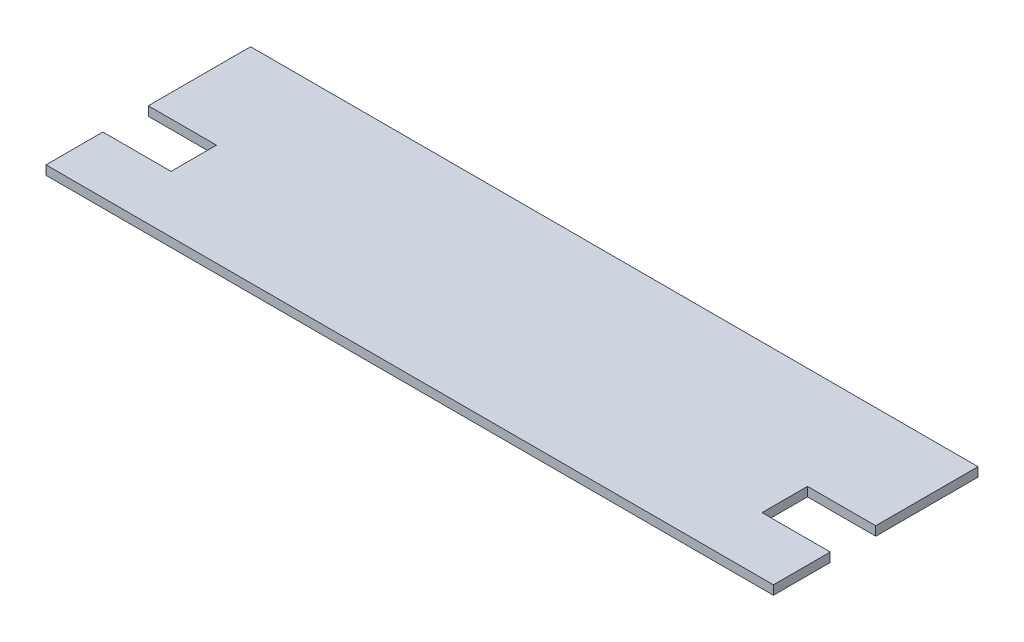
ISO-10303-21;
HEADER;
FILE_DESCRIPTION(('STEP AP214'),'2;1');
FILE_NAME('part.step','',(''),(''),'','','');
FILE_SCHEMA(('AUTOMOTIVE_DESIGN { 1 0 10303 214 1 1 1 1 }'));
ENDSEC;
DATA;
#1=APPLICATION_CONTEXT('core data for automotive mechanical design processes');
#2=APPLICATION_PROTOCOL_DEFINITION('international standard','automotive_design',2000,#1);
#3=PRODUCT_CONTEXT('',#1,'mechanical');
#4=PRODUCT('Part','Part','',(#3));
#5=PRODUCT_RELATED_PRODUCT_CATEGORY('part','',(#4));
#6=PRODUCT_DEFINITION_FORMATION('','',#4);
#7=PRODUCT_DEFINITION_CONTEXT('part definition',#1,'design');
#8=PRODUCT_DEFINITION('design','',#6,#7);
#9=PRODUCT_DEFINITION_SHAPE('','',#8);
#10=(LENGTH_UNIT() NAMED_UNIT(*) SI_UNIT(.MILLI.,.METRE.));
#11=(NAMED_UNIT(*) PLANE_ANGLE_UNIT() SI_UNIT($,.RADIAN.));
#12=(NAMED_UNIT(*) SI_UNIT($,.STERADIAN.) SOLID_ANGLE_UNIT());
#13=UNCERTAINTY_MEASURE_WITH_UNIT(LENGTH_MEASURE(1.E-05),#10,'distance_accuracy_value','');
#14=(GEOMETRIC_REPRESENTATION_CONTEXT(3) GLOBAL_UNCERTAINTY_ASSIGNED_CONTEXT((#13)) GLOBAL_UNIT_ASSIGNED_CONTEXT((#10,
#11,#12)) REPRESENTATION_CONTEXT('',''));
#15=CARTESIAN_POINT('',(0.,0.,0.));
#16=DIRECTION('',(0.,0.,1.));
#17=DIRECTION('',(1.,0.,0.));
#18=AXIS2_PLACEMENT_3D('',#15,#16,#17);
#19=CARTESIAN_POINT('',(0.,4.,0.));
#20=DIRECTION('',(1.,0.,0.));
#21=DIRECTION('',(0.,0.,-1.));
#22=AXIS2_PLACEMENT_3D('',#19,#20,#21);
#23=PLANE('',#22);
#24=DIRECTION('',(0.,0.,1.));
#25=VECTOR('',#24,1.);
#26=CARTESIAN_POINT('',(0.,4.,0.));
#27=LINE('',#26,#25);
#28=CARTESIAN_POINT('',(0.,4.,-25.));
#29=VERTEX_POINT('',#28);
#30=CARTESIAN_POINT('',(0.,4.,0.));
#31=VERTEX_POINT('',#30);
#32=EDGE_CURVE('E188',#29,#31,#27,.T.);
#33=ORIENTED_EDGE('',*,*,#32,.F.);
#34=DIRECTION('',(0.,1.,0.));
#35=VECTOR('',#34,1.);
#36=CARTESIAN_POINT('',(0.,0.,-25.));
#37=LINE('',#36,#35);
#38=CARTESIAN_POINT('',(0.,0.,-25.));
#39=VERTEX_POINT('',#38);
#40=EDGE_CURVE('E159',#39,#29,#37,.T.);
#41=ORIENTED_EDGE('',*,*,#40,.F.);
#42=DIRECTION('',(0.,0.,1.));
#43=VECTOR('',#42,1.);
#44=CARTESIAN_POINT('',(0.,0.,0.));
#45=LINE('',#44,#43);
#46=CARTESIAN_POINT('',(0.,0.,0.));
#47=VERTEX_POINT('',#46);
#48=EDGE_CURVE('E158',#39,#47,#45,.T.);
#49=ORIENTED_EDGE('',*,*,#48,.T.);
#50=DIRECTION('',(0.,-1.,0.));
#51=VECTOR('',#50,1.);
#52=CARTESIAN_POINT('',(0.,4.,0.));
#53=LINE('',#52,#51);
#54=EDGE_CURVE('E11',#31,#47,#53,.T.);
#55=ORIENTED_EDGE('',*,*,#54,.F.);
#56=EDGE_LOOP('',(#33,#41,#49,#55));
#57=FACE_BOUND('',#56,.T.);
#58=ADVANCED_FACE('F37',(#57),#23,.F.);
#59=CARTESIAN_POINT('',(320.,4.,0.));
#60=DIRECTION('',(-1.,0.,0.));
#61=DIRECTION('',(0.,0.,1.));
#62=AXIS2_PLACEMENT_3D('',#59,#60,#61);
#63=PLANE('',#62);
#64=DIRECTION('',(0.,0.,-1.));
#65=VECTOR('',#64,1.);
#66=CARTESIAN_POINT('',(320.,4.,0.));
#67=LINE('',#66,#65);
#68=CARTESIAN_POINT('',(320.,4.,-45.));
#69=VERTEX_POINT('',#68);
#70=CARTESIAN_POINT('',(320.,4.,-90.));
#71=VERTEX_POINT('',#70);
#72=EDGE_CURVE('E190',#69,#71,#67,.T.);
#73=ORIENTED_EDGE('',*,*,#72,.F.);
#74=DIRECTION('',(0.,1.,0.));
#75=VECTOR('',#74,1.);
#76=CARTESIAN_POINT('',(320.,0.,-45.));
#77=LINE('',#76,#75);
#78=CARTESIAN_POINT('',(320.,0.,-45.));
#79=VERTEX_POINT('',#78);
#80=EDGE_CURVE('E180',#79,#69,#77,.T.);
#81=ORIENTED_EDGE('',*,*,#80,.F.);
#82=DIRECTION('',(0.,0.,-1.));
#83=VECTOR('',#82,1.);
#84=CARTESIAN_POINT('',(320.,0.,0.));
#85=LINE('',#84,#83);
#86=CARTESIAN_POINT('',(320.,0.,-90.));
#87=VERTEX_POINT('',#86);
#88=EDGE_CURVE('E201',#79,#87,#85,.T.);
#89=ORIENTED_EDGE('',*,*,#88,.T.);
#90=DIRECTION('',(0.,-1.,0.));
#91=VECTOR('',#90,1.);
#92=CARTESIAN_POINT('',(320.,4.,-90.));
#93=LINE('',#92,#91);
#94=EDGE_CURVE('E209',#71,#87,#93,.T.);
#95=ORIENTED_EDGE('',*,*,#94,.F.);
#96=EDGE_LOOP('',(#73,#81,#89,#95));
#97=FACE_BOUND('',#96,.T.);
#98=ADVANCED_FACE('F248',(#97),#63,.F.);
#99=CARTESIAN_POINT('',(0.,0.,-90.));
#100=VERTEX_POINT('',#99);
#101=CARTESIAN_POINT('',(0.,0.,-45.));
#102=VERTEX_POINT('',#101);
#103=EDGE_CURVE('E197',#100,#102,#45,.T.);
#104=ORIENTED_EDGE('',*,*,#103,.T.);
#105=DIRECTION('',(0.,1.,0.));
#106=VECTOR('',#105,1.);
#107=CARTESIAN_POINT('',(0.,0.,-45.));
#108=LINE('',#107,#106);
#109=CARTESIAN_POINT('',(0.,4.,-45.));
#110=VERTEX_POINT('',#109);
#111=EDGE_CURVE('E60',#102,#110,#108,.T.);
#112=ORIENTED_EDGE('',*,*,#111,.T.);
#113=CARTESIAN_POINT('',(0.,4.,-90.));
#114=VERTEX_POINT('',#113);
#115=EDGE_CURVE('E184',#114,#110,#27,.T.);
#116=ORIENTED_EDGE('',*,*,#115,.F.);
#117=DIRECTION('',(0.,-1.,0.));
#118=VECTOR('',#117,1.);
#119=CARTESIAN_POINT('',(0.,4.,-90.));
#120=LINE('',#119,#118);
#121=EDGE_CURVE('E196',#114,#100,#120,.T.);
#122=ORIENTED_EDGE('',*,*,#121,.T.);
#123=EDGE_LOOP('',(#104,#112,#116,#122));
#124=FACE_BOUND('',#123,.T.);
#125=ADVANCED_FACE('F39',(#124),#23,.F.);
#126=CARTESIAN_POINT('',(0.,4.,0.));
#127=DIRECTION('',(0.,0.,-1.));
#128=DIRECTION('',(-1.,0.,0.));
#129=AXIS2_PLACEMENT_3D('',#126,#127,#128);
#130=PLANE('',#129);
#131=DIRECTION('',(1.,0.,0.));
#132=VECTOR('',#131,1.);
#133=CARTESIAN_POINT('',(0.,0.,0.));
#134=LINE('',#133,#132);
#135=CARTESIAN_POINT('',(320.,0.,0.));
#136=VERTEX_POINT('',#135);
#137=EDGE_CURVE('E199',#47,#136,#134,.T.);
#138=ORIENTED_EDGE('',*,*,#137,.T.);
#139=DIRECTION('',(0.,-1.,0.));
#140=VECTOR('',#139,1.);
#141=CARTESIAN_POINT('',(320.,4.,0.));
#142=LINE('',#141,#140);
#143=CARTESIAN_POINT('',(320.,4.,0.));
#144=VERTEX_POINT('',#143);
#145=EDGE_CURVE('E45',#144,#136,#142,.T.);
#146=ORIENTED_EDGE('',*,*,#145,.F.);
#147=DIRECTION('',(1.,0.,0.));
#148=VECTOR('',#147,1.);
#149=CARTESIAN_POINT('',(0.,4.,0.));
#150=LINE('',#149,#148);
#151=EDGE_CURVE('E187',#31,#144,#150,.T.);
#152=ORIENTED_EDGE('',*,*,#151,.F.);
#153=ORIENTED_EDGE('',*,*,#54,.T.);
#154=EDGE_LOOP('',(#138,#146,#152,#153));
#155=FACE_BOUND('',#154,.T.);
#156=ADVANCED_FACE('F232',(#155),#130,.F.);
#157=CARTESIAN_POINT('',(320.,0.,-25.));
#158=VERTEX_POINT('',#157);
#159=EDGE_CURVE('E202',#136,#158,#85,.T.);
#160=ORIENTED_EDGE('',*,*,#159,.T.);
#161=DIRECTION('',(0.,1.,0.));
#162=VECTOR('',#161,1.);
#163=CARTESIAN_POINT('',(320.,0.,-25.));
#164=LINE('',#163,#162);
#165=CARTESIAN_POINT('',(320.,4.,-25.));
#166=VERTEX_POINT('',#165);
#167=EDGE_CURVE('E52',#158,#166,#164,.T.);
#168=ORIENTED_EDGE('',*,*,#167,.T.);
#169=EDGE_CURVE('E191',#144,#166,#67,.T.);
#170=ORIENTED_EDGE('',*,*,#169,.F.);
#171=ORIENTED_EDGE('',*,*,#145,.T.);
#172=EDGE_LOOP('',(#160,#168,#170,#171));
#173=FACE_BOUND('',#172,.T.);
#174=ADVANCED_FACE('F216',(#173),#63,.F.);
#175=CARTESIAN_POINT('',(0.,4.,-90.));
#176=DIRECTION('',(0.,0.,1.));
#177=DIRECTION('',(1.,0.,0.));
#178=AXIS2_PLACEMENT_3D('',#175,#176,#177);
#179=PLANE('',#178);
#180=DIRECTION('',(-1.,0.,0.));
#181=VECTOR('',#180,1.);
#182=CARTESIAN_POINT('',(0.,0.,-90.));
#183=LINE('',#182,#181);
#184=EDGE_CURVE('E205',#87,#100,#183,.T.);
#185=ORIENTED_EDGE('',*,*,#184,.T.);
#186=ORIENTED_EDGE('',*,*,#121,.F.);
#187=DIRECTION('',(-1.,0.,0.));
#188=VECTOR('',#187,1.);
#189=CARTESIAN_POINT('',(0.,4.,-90.));
#190=LINE('',#189,#188);
#191=EDGE_CURVE('E194',#71,#114,#190,.T.);
#192=ORIENTED_EDGE('',*,*,#191,.F.);
#193=ORIENTED_EDGE('',*,*,#94,.T.);
#194=EDGE_LOOP('',(#185,#186,#192,#193));
#195=FACE_BOUND('',#194,.T.);
#196=ADVANCED_FACE('F243',(#195),#179,.F.);
#197=CARTESIAN_POINT('',(0.,4.,0.));
#198=DIRECTION('',(0.,-1.,0.));
#199=DIRECTION('',(0.,0.,-1.));
#200=AXIS2_PLACEMENT_3D('',#197,#198,#199);
#201=PLANE('',#200);
#202=DIRECTION('',(0.,0.,-1.));
#203=VECTOR('',#202,1.);
#204=CARTESIAN_POINT('',(30.,4.,-45.));
#205=LINE('',#204,#203);
#206=CARTESIAN_POINT('',(30.,4.,-25.));
#207=VERTEX_POINT('',#206);
#208=CARTESIAN_POINT('',(30.,4.,-45.));
#209=VERTEX_POINT('',#208);
#210=EDGE_CURVE('E134',#207,#209,#205,.T.);
#211=ORIENTED_EDGE('',*,*,#210,.F.);
#212=DIRECTION('',(1.,0.,0.));
#213=VECTOR('',#212,1.);
#214=CARTESIAN_POINT('',(0.,4.,-25.));
#215=LINE('',#214,#213);
#216=EDGE_CURVE('E146',#29,#207,#215,.T.);
#217=ORIENTED_EDGE('',*,*,#216,.F.);
#218=ORIENTED_EDGE('',*,*,#32,.T.);
#219=ORIENTED_EDGE('',*,*,#151,.T.);
#220=ORIENTED_EDGE('',*,*,#169,.T.);
#221=DIRECTION('',(1.,0.,0.));
#222=VECTOR('',#221,1.);
#223=CARTESIAN_POINT('',(320.,4.,-25.));
#224=LINE('',#223,#222);
#225=CARTESIAN_POINT('',(290.,4.,-25.));
#226=VERTEX_POINT('',#225);
#227=EDGE_CURVE('E175',#226,#166,#224,.T.);
#228=ORIENTED_EDGE('',*,*,#227,.F.);
#229=DIRECTION('',(0.,0.,1.));
#230=VECTOR('',#229,1.);
#231=CARTESIAN_POINT('',(290.,4.,-45.));
#232=LINE('',#231,#230);
#233=CARTESIAN_POINT('',(290.,4.,-45.));
#234=VERTEX_POINT('',#233);
#235=EDGE_CURVE('E172',#234,#226,#232,.T.);
#236=ORIENTED_EDGE('',*,*,#235,.F.);
#237=DIRECTION('',(-1.,0.,0.));
#238=VECTOR('',#237,1.);
#239=CARTESIAN_POINT('',(320.,4.,-45.));
#240=LINE('',#239,#238);
#241=EDGE_CURVE('E166',#69,#234,#240,.T.);
#242=ORIENTED_EDGE('',*,*,#241,.F.);
#243=ORIENTED_EDGE('',*,*,#72,.T.);
#244=ORIENTED_EDGE('',*,*,#191,.T.);
#245=ORIENTED_EDGE('',*,*,#115,.T.);
#246=DIRECTION('',(-1.,0.,0.));
#247=VECTOR('',#246,1.);
#248=CARTESIAN_POINT('',(0.,4.,-45.));
#249=LINE('',#248,#247);
#250=EDGE_CURVE('E149',#209,#110,#249,.T.);
#251=ORIENTED_EDGE('',*,*,#250,.F.);
#252=EDGE_LOOP('',(#211,#217,#218,#219,#220,#228,#236,#242,#243,#244,#245,#251));
#253=FACE_BOUND('',#252,.T.);
#254=ADVANCED_FACE('F228',(#253),#201,.F.);
#255=CARTESIAN_POINT('',(0.,0.,0.));
#256=DIRECTION('',(0.,-1.,0.));
#257=DIRECTION('',(0.,0.,-1.));
#258=AXIS2_PLACEMENT_3D('',#255,#256,#257);
#259=PLANE('',#258);
#260=DIRECTION('',(1.,0.,0.));
#261=VECTOR('',#260,1.);
#262=CARTESIAN_POINT('',(0.,0.,-25.));
#263=LINE('',#262,#261);
#264=CARTESIAN_POINT('',(30.,0.,-25.));
#265=VERTEX_POINT('',#264);
#266=EDGE_CURVE('E136',#39,#265,#263,.T.);
#267=ORIENTED_EDGE('',*,*,#266,.T.);
#268=DIRECTION('',(0.,0.,-1.));
#269=VECTOR('',#268,1.);
#270=CARTESIAN_POINT('',(30.,0.,-45.));
#271=LINE('',#270,#269);
#272=CARTESIAN_POINT('',(30.,0.,-45.));
#273=VERTEX_POINT('',#272);
#274=EDGE_CURVE('E131',#265,#273,#271,.T.);
#275=ORIENTED_EDGE('',*,*,#274,.T.);
#276=DIRECTION('',(-1.,0.,0.));
#277=VECTOR('',#276,1.);
#278=CARTESIAN_POINT('',(0.,0.,-45.));
#279=LINE('',#278,#277);
#280=EDGE_CURVE('E138',#273,#102,#279,.T.);
#281=ORIENTED_EDGE('',*,*,#280,.T.);
#282=ORIENTED_EDGE('',*,*,#103,.F.);
#283=ORIENTED_EDGE('',*,*,#184,.F.);
#284=ORIENTED_EDGE('',*,*,#88,.F.);
#285=DIRECTION('',(-1.,0.,0.));
#286=VECTOR('',#285,1.);
#287=CARTESIAN_POINT('',(320.,0.,-45.));
#288=LINE('',#287,#286);
#289=CARTESIAN_POINT('',(290.,0.,-45.));
#290=VERTEX_POINT('',#289);
#291=EDGE_CURVE('E168',#79,#290,#288,.T.);
#292=ORIENTED_EDGE('',*,*,#291,.T.);
#293=DIRECTION('',(0.,0.,1.));
#294=VECTOR('',#293,1.);
#295=CARTESIAN_POINT('',(290.,0.,-45.));
#296=LINE('',#295,#294);
#297=CARTESIAN_POINT('',(290.,0.,-25.));
#298=VERTEX_POINT('',#297);
#299=EDGE_CURVE('E162',#290,#298,#296,.T.);
#300=ORIENTED_EDGE('',*,*,#299,.T.);
#301=DIRECTION('',(1.,0.,0.));
#302=VECTOR('',#301,1.);
#303=CARTESIAN_POINT('',(320.,0.,-25.));
#304=LINE('',#303,#302);
#305=EDGE_CURVE('E165',#298,#158,#304,.T.);
#306=ORIENTED_EDGE('',*,*,#305,.T.);
#307=ORIENTED_EDGE('',*,*,#159,.F.);
#308=ORIENTED_EDGE('',*,*,#137,.F.);
#309=ORIENTED_EDGE('',*,*,#48,.F.);
#310=EDGE_LOOP('',(#267,#275,#281,#282,#283,#284,#292,#300,#306,#307,#308,#309));
#311=FACE_BOUND('',#310,.T.);
#312=ADVANCED_FACE('F144',(#311),#259,.T.);
#313=CARTESIAN_POINT('',(290.,0.,-45.));
#314=DIRECTION('',(-1.,0.,0.));
#315=DIRECTION('',(0.,0.,1.));
#316=AXIS2_PLACEMENT_3D('',#313,#314,#315);
#317=PLANE('',#316);
#318=ORIENTED_EDGE('',*,*,#235,.T.);
#319=DIRECTION('',(0.,1.,0.));
#320=VECTOR('',#319,1.);
#321=CARTESIAN_POINT('',(290.,0.,-25.));
#322=LINE('',#321,#320);
#323=EDGE_CURVE('E171',#298,#226,#322,.T.);
#324=ORIENTED_EDGE('',*,*,#323,.F.);
#325=ORIENTED_EDGE('',*,*,#299,.F.);
#326=DIRECTION('',(0.,1.,0.));
#327=VECTOR('',#326,1.);
#328=CARTESIAN_POINT('',(290.,0.,-45.));
#329=LINE('',#328,#327);
#330=EDGE_CURVE('E154',#290,#234,#329,.T.);
#331=ORIENTED_EDGE('',*,*,#330,.T.);
#332=EDGE_LOOP('',(#318,#324,#325,#331));
#333=FACE_BOUND('',#332,.T.);
#334=ADVANCED_FACE('F225',(#333),#317,.F.);
#335=CARTESIAN_POINT('',(320.,0.,-45.));
#336=DIRECTION('',(0.,0.,-1.));
#337=DIRECTION('',(-1.,0.,0.));
#338=AXIS2_PLACEMENT_3D('',#335,#336,#337);
#339=PLANE('',#338);
#340=ORIENTED_EDGE('',*,*,#241,.T.);
#341=ORIENTED_EDGE('',*,*,#330,.F.);
#342=ORIENTED_EDGE('',*,*,#291,.F.);
#343=ORIENTED_EDGE('',*,*,#80,.T.);
#344=EDGE_LOOP('',(#340,#341,#342,#343));
#345=FACE_BOUND('',#344,.T.);
#346=ADVANCED_FACE('F251',(#345),#339,.F.);
#347=CARTESIAN_POINT('',(320.,0.,-25.));
#348=DIRECTION('',(0.,0.,1.));
#349=DIRECTION('',(1.,0.,0.));
#350=AXIS2_PLACEMENT_3D('',#347,#348,#349);
#351=PLANE('',#350);
#352=ORIENTED_EDGE('',*,*,#227,.T.);
#353=ORIENTED_EDGE('',*,*,#167,.F.);
#354=ORIENTED_EDGE('',*,*,#305,.F.);
#355=ORIENTED_EDGE('',*,*,#323,.T.);
#356=EDGE_LOOP('',(#352,#353,#354,#355));
#357=FACE_BOUND('',#356,.T.);
#358=ADVANCED_FACE('F221',(#357),#351,.F.);
#359=CARTESIAN_POINT('',(30.,0.,-45.));
#360=DIRECTION('',(1.,0.,0.));
#361=DIRECTION('',(0.,0.,-1.));
#362=AXIS2_PLACEMENT_3D('',#359,#360,#361);
#363=PLANE('',#362);
#364=ORIENTED_EDGE('',*,*,#210,.T.);
#365=DIRECTION('',(0.,1.,0.));
#366=VECTOR('',#365,1.);
#367=CARTESIAN_POINT('',(30.,0.,-45.));
#368=LINE('',#367,#366);
#369=EDGE_CURVE('E128',#273,#209,#368,.T.);
#370=ORIENTED_EDGE('',*,*,#369,.F.);
#371=ORIENTED_EDGE('',*,*,#274,.F.);
#372=DIRECTION('',(0.,1.,0.));
#373=VECTOR('',#372,1.);
#374=CARTESIAN_POINT('',(30.,0.,-25.));
#375=LINE('',#374,#373);
#376=EDGE_CURVE('E156',#265,#207,#375,.T.);
#377=ORIENTED_EDGE('',*,*,#376,.T.);
#378=EDGE_LOOP('',(#364,#370,#371,#377));
#379=FACE_BOUND('',#378,.T.);
#380=ADVANCED_FACE('F129',(#379),#363,.F.);
#381=CARTESIAN_POINT('',(0.,0.,-25.));
#382=DIRECTION('',(0.,0.,1.));
#383=DIRECTION('',(1.,0.,0.));
#384=AXIS2_PLACEMENT_3D('',#381,#382,#383);
#385=PLANE('',#384);
#386=ORIENTED_EDGE('',*,*,#216,.T.);
#387=ORIENTED_EDGE('',*,*,#376,.F.);
#388=ORIENTED_EDGE('',*,*,#266,.F.);
#389=ORIENTED_EDGE('',*,*,#40,.T.);
#390=EDGE_LOOP('',(#386,#387,#388,#389));
#391=FACE_BOUND('',#390,.T.);
#392=ADVANCED_FACE('F236',(#391),#385,.F.);
#393=CARTESIAN_POINT('',(0.,0.,-45.));
#394=DIRECTION('',(0.,0.,-1.));
#395=DIRECTION('',(-1.,0.,0.));
#396=AXIS2_PLACEMENT_3D('',#393,#394,#395);
#397=PLANE('',#396);
#398=ORIENTED_EDGE('',*,*,#250,.T.);
#399=ORIENTED_EDGE('',*,*,#111,.F.);
#400=ORIENTED_EDGE('',*,*,#280,.F.);
#401=ORIENTED_EDGE('',*,*,#369,.T.);
#402=EDGE_LOOP('',(#398,#399,#400,#401));
#403=FACE_BOUND('',#402,.T.);
#404=ADVANCED_FACE('F139',(#403),#397,.F.);
#405=CLOSED_SHELL('',(#58,#98,#125,#156,#174,#196,#254,#312,#334,#346,#358,#380,#392,#404));
#406=MANIFOLD_SOLID_BREP('B2',#405);
#407=ADVANCED_BREP_SHAPE_REPRESENTATION('',(#18,#406),#14);
#408=SHAPE_DEFINITION_REPRESENTATION(#9,#407);
ENDSEC;
END-ISO-10303-21;
